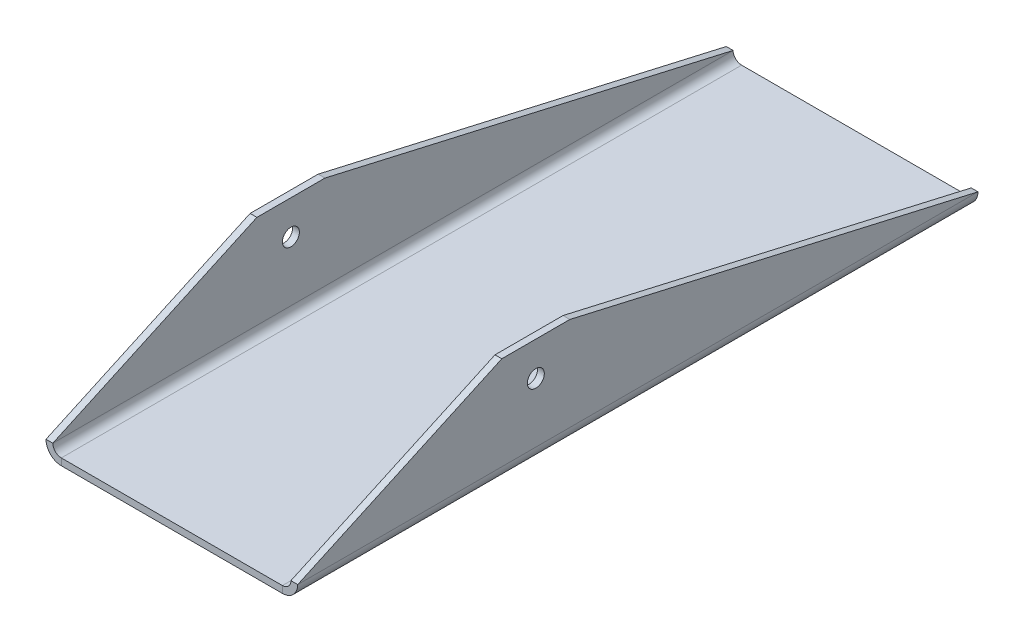
ISO-10303-21;
HEADER;
FILE_DESCRIPTION(('STEP AP214'),'2;1');
FILE_NAME('part.step','',(''),(''),'','','');
FILE_SCHEMA(('AUTOMOTIVE_DESIGN { 1 0 10303 214 1 1 1 1 }'));
ENDSEC;
DATA;
#1=APPLICATION_CONTEXT('core data for automotive mechanical design processes');
#2=APPLICATION_PROTOCOL_DEFINITION('international standard','automotive_design',2000,#1);
#3=PRODUCT_CONTEXT('',#1,'mechanical');
#4=PRODUCT('Part','Part','',(#3));
#5=PRODUCT_RELATED_PRODUCT_CATEGORY('part','',(#4));
#6=PRODUCT_DEFINITION_FORMATION('','',#4);
#7=PRODUCT_DEFINITION_CONTEXT('part definition',#1,'design');
#8=PRODUCT_DEFINITION('design','',#6,#7);
#9=PRODUCT_DEFINITION_SHAPE('','',#8);
#10=(LENGTH_UNIT() NAMED_UNIT(*) SI_UNIT(.MILLI.,.METRE.));
#11=(NAMED_UNIT(*) PLANE_ANGLE_UNIT() SI_UNIT($,.RADIAN.));
#12=(NAMED_UNIT(*) SI_UNIT($,.STERADIAN.) SOLID_ANGLE_UNIT());
#13=UNCERTAINTY_MEASURE_WITH_UNIT(LENGTH_MEASURE(1.E-05),#10,'distance_accuracy_value','');
#14=(GEOMETRIC_REPRESENTATION_CONTEXT(3) GLOBAL_UNCERTAINTY_ASSIGNED_CONTEXT((#13)) GLOBAL_UNIT_ASSIGNED_CONTEXT((#10,
#11,#12)) REPRESENTATION_CONTEXT('',''));
#15=CARTESIAN_POINT('',(0.,0.,0.));
#16=DIRECTION('',(0.,0.,1.));
#17=DIRECTION('',(1.,0.,0.));
#18=AXIS2_PLACEMENT_3D('',#15,#16,#17);
#19=CARTESIAN_POINT('',(88.9,38.1,254.));
#20=DIRECTION('',(0.,1.,0.));
#21=DIRECTION('',(0.,0.,1.));
#22=AXIS2_PLACEMENT_3D('',#19,#20,#21);
#23=PLANE('',#22);
#24=DIRECTION('',(0.,0.,-1.));
#25=VECTOR('',#24,1.);
#26=CARTESIAN_POINT('',(91.44,38.1,254.));
#27=LINE('',#26,#25);
#28=CARTESIAN_POINT('',(91.44,38.1,177.8));
#29=VERTEX_POINT('',#28);
#30=CARTESIAN_POINT('',(91.44,38.1,152.4));
#31=VERTEX_POINT('',#30);
#32=EDGE_CURVE('E201',#29,#31,#27,.T.);
#33=ORIENTED_EDGE('',*,*,#32,.T.);
#34=DIRECTION('',(-1.,0.,0.));
#35=VECTOR('',#34,1.);
#36=CARTESIAN_POINT('',(88.9,38.1,152.4));
#37=LINE('',#36,#35);
#38=CARTESIAN_POINT('',(88.9,38.1,152.4));
#39=VERTEX_POINT('',#38);
#40=EDGE_CURVE('E274',#39,#31,#37,.F.);
#41=ORIENTED_EDGE('',*,*,#40,.F.);
#42=DIRECTION('',(0.,0.,-1.));
#43=VECTOR('',#42,1.);
#44=CARTESIAN_POINT('',(88.9,38.1,254.));
#45=LINE('',#44,#43);
#46=CARTESIAN_POINT('',(88.9,38.1,177.8));
#47=VERTEX_POINT('',#46);
#48=EDGE_CURVE('E198',#47,#39,#45,.T.);
#49=ORIENTED_EDGE('',*,*,#48,.F.);
#50=DIRECTION('',(-1.,0.,0.));
#51=VECTOR('',#50,1.);
#52=CARTESIAN_POINT('',(88.9,38.1,177.8));
#53=LINE('',#52,#51);
#54=EDGE_CURVE('E54',#47,#29,#53,.F.);
#55=ORIENTED_EDGE('',*,*,#54,.T.);
#56=EDGE_LOOP('',(#33,#41,#49,#55));
#57=FACE_BOUND('',#56,.T.);
#58=ADVANCED_FACE('F39',(#57),#23,.T.);
#59=CARTESIAN_POINT('',(-2.54,38.1,254.));
#60=DIRECTION('',(0.,1.,0.));
#61=DIRECTION('',(0.,0.,1.));
#62=AXIS2_PLACEMENT_3D('',#59,#60,#61);
#63=PLANE('',#62);
#64=DIRECTION('',(0.,0.,-1.));
#65=VECTOR('',#64,1.);
#66=CARTESIAN_POINT('',(0.,38.1,254.));
#67=LINE('',#66,#65);
#68=CARTESIAN_POINT('',(0.,38.1,177.8));
#69=VERTEX_POINT('',#68);
#70=CARTESIAN_POINT('',(0.,38.1,152.4));
#71=VERTEX_POINT('',#70);
#72=EDGE_CURVE('E183',#69,#71,#67,.T.);
#73=ORIENTED_EDGE('',*,*,#72,.T.);
#74=DIRECTION('',(1.,0.,0.));
#75=VECTOR('',#74,1.);
#76=CARTESIAN_POINT('',(0.,38.1,152.4));
#77=LINE('',#76,#75);
#78=CARTESIAN_POINT('',(-2.54,38.1,152.4));
#79=VERTEX_POINT('',#78);
#80=EDGE_CURVE('E263',#71,#79,#77,.F.);
#81=ORIENTED_EDGE('',*,*,#80,.T.);
#82=DIRECTION('',(0.,0.,-1.));
#83=VECTOR('',#82,1.);
#84=CARTESIAN_POINT('',(-2.54,38.1,254.));
#85=LINE('',#84,#83);
#86=CARTESIAN_POINT('',(-2.54,38.1,177.8));
#87=VERTEX_POINT('',#86);
#88=EDGE_CURVE('E142',#87,#79,#85,.T.);
#89=ORIENTED_EDGE('',*,*,#88,.F.);
#90=DIRECTION('',(1.,0.,0.));
#91=VECTOR('',#90,1.);
#92=CARTESIAN_POINT('',(0.,38.1,177.8));
#93=LINE('',#92,#91);
#94=EDGE_CURVE('E116',#69,#87,#93,.F.);
#95=ORIENTED_EDGE('',*,*,#94,.F.);
#96=EDGE_LOOP('',(#73,#81,#89,#95));
#97=FACE_BOUND('',#96,.T.);
#98=ADVANCED_FACE('F284',(#97),#63,.T.);
#99=CARTESIAN_POINT('',(91.44,0.,254.));
#100=DIRECTION('',(-1.,0.,0.));
#101=DIRECTION('',(0.,0.,1.));
#102=AXIS2_PLACEMENT_3D('',#99,#100,#101);
#103=PLANE('',#102);
#104=DIRECTION('',(0.,0.223376156329396,0.974732318528274));
#105=VECTOR('',#104,1.);
#106=CARTESIAN_POINT('',(91.44,58.3204948453608,240.634886597938));
#107=LINE('',#106,#105);
#108=CARTESIAN_POINT('',(91.44,3.175,0.));
#109=VERTEX_POINT('',#108);
#110=EDGE_CURVE('E91',#109,#31,#107,.T.);
#111=ORIENTED_EDGE('',*,*,#110,.T.);
#112=ORIENTED_EDGE('',*,*,#32,.F.);
#113=DIRECTION('',(0.,-0.416654710493214,0.909064822894284));
#114=VECTOR('',#113,1.);
#115=CARTESIAN_POINT('',(91.44,2.62381635581062,255.202582496413));
#116=LINE('',#115,#114);
#117=CARTESIAN_POINT('',(91.44,3.175,254.));
#118=VERTEX_POINT('',#117);
#119=EDGE_CURVE('E253',#29,#118,#116,.T.);
#120=ORIENTED_EDGE('',*,*,#119,.T.);
#121=DIRECTION('',(0.,0.,-1.));
#122=VECTOR('',#121,1.);
#123=CARTESIAN_POINT('',(91.44,3.175,254.));
#124=LINE('',#123,#122);
#125=EDGE_CURVE('E157',#118,#109,#124,.T.);
#126=ORIENTED_EDGE('',*,*,#125,.T.);
#127=EDGE_LOOP('',(#111,#112,#120,#126));
#128=FACE_BOUND('',#127,.T.);
#129=CARTESIAN_POINT('',(91.44,25.4,165.1));
#130=DIRECTION('',(-1.,0.,0.));
#131=DIRECTION('',(0.,0.,1.));
#132=AXIS2_PLACEMENT_3D('',#129,#130,#131);
#133=CIRCLE('',#132,3.175);
#134=CARTESIAN_POINT('',(91.44,25.4,168.275));
#135=VERTEX_POINT('',#134);
#136=EDGE_CURVE('E256',#135,#135,#133,.T.);
#137=ORIENTED_EDGE('',*,*,#136,.T.);
#138=EDGE_LOOP('',(#137));
#139=FACE_BOUND('',#138,.T.);
#140=ADVANCED_FACE('F301',(#128,#139),#103,.F.);
#141=CARTESIAN_POINT('',(88.9,0.,254.));
#142=DIRECTION('',(-1.,0.,0.));
#143=DIRECTION('',(0.,0.,1.));
#144=AXIS2_PLACEMENT_3D('',#141,#142,#143);
#145=PLANE('',#144);
#146=CARTESIAN_POINT('',(88.9,25.4,165.1));
#147=DIRECTION('',(-1.,0.,0.));
#148=DIRECTION('',(0.,0.,1.));
#149=AXIS2_PLACEMENT_3D('',#146,#147,#148);
#150=CIRCLE('',#149,3.175);
#151=CARTESIAN_POINT('',(88.9,25.4,168.275));
#152=VERTEX_POINT('',#151);
#153=EDGE_CURVE('E266',#152,#152,#150,.T.);
#154=ORIENTED_EDGE('',*,*,#153,.F.);
#155=EDGE_LOOP('',(#154));
#156=FACE_BOUND('',#155,.T.);
#157=ORIENTED_EDGE('',*,*,#48,.T.);
#158=DIRECTION('',(0.,0.223376156329396,0.974732318528274));
#159=VECTOR('',#158,1.);
#160=CARTESIAN_POINT('',(88.9,58.3204948453608,240.634886597938));
#161=LINE('',#160,#159);
#162=CARTESIAN_POINT('',(88.9,3.175,0.));
#163=VERTEX_POINT('',#162);
#164=EDGE_CURVE('E276',#163,#39,#161,.T.);
#165=ORIENTED_EDGE('',*,*,#164,.F.);
#166=DIRECTION('',(0.,0.,-1.));
#167=VECTOR('',#166,1.);
#168=CARTESIAN_POINT('',(88.9,3.175,254.));
#169=LINE('',#168,#167);
#170=CARTESIAN_POINT('',(88.9,3.175,254.));
#171=VERTEX_POINT('',#170);
#172=EDGE_CURVE('E195',#171,#163,#169,.T.);
#173=ORIENTED_EDGE('',*,*,#172,.F.);
#174=DIRECTION('',(0.,-0.416654710493214,0.909064822894284));
#175=VECTOR('',#174,1.);
#176=CARTESIAN_POINT('',(88.9,2.62381635581062,255.202582496413));
#177=LINE('',#176,#175);
#178=EDGE_CURVE('E254',#47,#171,#177,.T.);
#179=ORIENTED_EDGE('',*,*,#178,.F.);
#180=EDGE_LOOP('',(#157,#165,#173,#179));
#181=FACE_BOUND('',#180,.T.);
#182=ADVANCED_FACE('F313',(#156,#181),#145,.T.);
#183=CARTESIAN_POINT('',(3.175,0.,254.));
#184=DIRECTION('',(0.,0.,1.));
#185=DIRECTION('',(1.,0.,0.));
#186=AXIS2_PLACEMENT_3D('',#183,#184,#185);
#187=PLANE('',#186);
#188=DIRECTION('',(0.,-1.,0.));
#189=VECTOR('',#188,1.);
#190=CARTESIAN_POINT('',(3.175,0.,254.));
#191=LINE('',#190,#189);
#192=CARTESIAN_POINT('',(3.175,0.,254.));
#193=VERTEX_POINT('',#192);
#194=CARTESIAN_POINT('',(3.175,-2.54,254.));
#195=VERTEX_POINT('',#194);
#196=EDGE_CURVE('E11',#193,#195,#191,.T.);
#197=ORIENTED_EDGE('',*,*,#196,.F.);
#198=CARTESIAN_POINT('',(3.175,3.17500000000001,254.));
#199=DIRECTION('',(0.,0.,-1.));
#200=DIRECTION('',(-1.,0.,0.));
#201=AXIS2_PLACEMENT_3D('',#198,#199,#200);
#202=CIRCLE('',#201,3.175);
#203=CARTESIAN_POINT('',(0.,3.17500000000003,254.));
#204=VERTEX_POINT('',#203);
#205=EDGE_CURVE('E130',#204,#193,#202,.F.);
#206=ORIENTED_EDGE('',*,*,#205,.F.);
#207=DIRECTION('',(1.,0.,0.));
#208=VECTOR('',#207,1.);
#209=CARTESIAN_POINT('',(-2.54,3.17500000000005,254.));
#210=LINE('',#209,#208);
#211=CARTESIAN_POINT('',(-2.54,3.17500000000005,254.));
#212=VERTEX_POINT('',#211);
#213=EDGE_CURVE('E47',#212,#204,#210,.T.);
#214=ORIENTED_EDGE('',*,*,#213,.F.);
#215=CARTESIAN_POINT('',(3.175,3.17500000000001,254.));
#216=DIRECTION('',(0.,0.,1.));
#217=DIRECTION('',(1.,0.,0.));
#218=AXIS2_PLACEMENT_3D('',#215,#216,#217);
#219=CIRCLE('',#218,5.715);
#220=EDGE_CURVE('E127',#212,#195,#219,.T.);
#221=ORIENTED_EDGE('',*,*,#220,.T.);
#222=EDGE_LOOP('',(#197,#206,#214,#221));
#223=FACE_BOUND('',#222,.T.);
#224=ADVANCED_FACE('F41',(#223),#187,.T.);
#225=CARTESIAN_POINT('',(-2.54,3.17500000000005,254.));
#226=DIRECTION('',(0.,0.,1.));
#227=DIRECTION('',(1.,0.,0.));
#228=AXIS2_PLACEMENT_3D('',#225,#226,#227);
#229=PLANE('',#228);
#230=DIRECTION('',(1.,0.,0.));
#231=VECTOR('',#230,1.);
#232=CARTESIAN_POINT('',(0.,0.,254.));
#233=LINE('',#232,#231);
#234=CARTESIAN_POINT('',(85.725,0.,254.));
#235=VERTEX_POINT('',#234);
#236=EDGE_CURVE('E152',#193,#235,#233,.T.);
#237=ORIENTED_EDGE('',*,*,#236,.F.);
#238=ORIENTED_EDGE('',*,*,#196,.T.);
#239=DIRECTION('',(1.,0.,0.));
#240=VECTOR('',#239,1.);
#241=CARTESIAN_POINT('',(0.,-2.54,254.));
#242=LINE('',#241,#240);
#243=CARTESIAN_POINT('',(85.725,-2.54,254.));
#244=VERTEX_POINT('',#243);
#245=EDGE_CURVE('E148',#195,#244,#242,.T.);
#246=ORIENTED_EDGE('',*,*,#245,.T.);
#247=DIRECTION('',(0.,1.,0.));
#248=VECTOR('',#247,1.);
#249=CARTESIAN_POINT('',(85.725,-2.54,254.));
#250=LINE('',#249,#248);
#251=EDGE_CURVE('E63',#244,#235,#250,.T.);
#252=ORIENTED_EDGE('',*,*,#251,.T.);
#253=EDGE_LOOP('',(#237,#238,#246,#252));
#254=FACE_BOUND('',#253,.T.);
#255=ADVANCED_FACE('F248',(#254),#229,.T.);
#256=CARTESIAN_POINT('',(0.,3.17500000000003,0.));
#257=DIRECTION('',(0.,0.,-1.));
#258=DIRECTION('',(-1.,0.,0.));
#259=AXIS2_PLACEMENT_3D('',#256,#257,#258);
#260=PLANE('',#259);
#261=DIRECTION('',(-1.,0.,0.));
#262=VECTOR('',#261,1.);
#263=CARTESIAN_POINT('',(0.,3.17500000000003,0.));
#264=LINE('',#263,#262);
#265=CARTESIAN_POINT('',(0.,3.175,0.));
#266=VERTEX_POINT('',#265);
#267=CARTESIAN_POINT('',(-2.54,3.17500000000005,0.));
#268=VERTEX_POINT('',#267);
#269=EDGE_CURVE('E131',#266,#268,#264,.T.);
#270=ORIENTED_EDGE('',*,*,#269,.F.);
#271=CARTESIAN_POINT('',(3.175,3.17500000000001,0.));
#272=DIRECTION('',(0.,0.,-1.));
#273=DIRECTION('',(-1.,0.,0.));
#274=AXIS2_PLACEMENT_3D('',#271,#272,#273);
#275=CIRCLE('',#274,3.175);
#276=CARTESIAN_POINT('',(3.175,0.,0.));
#277=VERTEX_POINT('',#276);
#278=EDGE_CURVE('E164',#266,#277,#275,.F.);
#279=ORIENTED_EDGE('',*,*,#278,.T.);
#280=DIRECTION('',(0.,1.,0.));
#281=VECTOR('',#280,1.);
#282=CARTESIAN_POINT('',(3.175,-2.54,0.));
#283=LINE('',#282,#281);
#284=CARTESIAN_POINT('',(3.175,-2.54,0.));
#285=VERTEX_POINT('',#284);
#286=EDGE_CURVE('E212',#285,#277,#283,.T.);
#287=ORIENTED_EDGE('',*,*,#286,.F.);
#288=CARTESIAN_POINT('',(3.175,3.17500000000001,0.));
#289=DIRECTION('',(0.,0.,1.));
#290=DIRECTION('',(1.,0.,0.));
#291=AXIS2_PLACEMENT_3D('',#288,#289,#290);
#292=CIRCLE('',#291,5.715);
#293=EDGE_CURVE('E167',#268,#285,#292,.T.);
#294=ORIENTED_EDGE('',*,*,#293,.F.);
#295=EDGE_LOOP('',(#270,#279,#287,#294));
#296=FACE_BOUND('',#295,.T.);
#297=ADVANCED_FACE('F225',(#296),#260,.T.);
#298=CARTESIAN_POINT('',(88.9,3.175,254.));
#299=DIRECTION('',(0.,0.,1.));
#300=DIRECTION('',(1.,0.,0.));
#301=AXIS2_PLACEMENT_3D('',#298,#299,#300);
#302=PLANE('',#301);
#303=DIRECTION('',(1.,0.,0.));
#304=VECTOR('',#303,1.);
#305=CARTESIAN_POINT('',(88.9,3.175,254.));
#306=LINE('',#305,#304);
#307=EDGE_CURVE('E209',#171,#118,#306,.T.);
#308=ORIENTED_EDGE('',*,*,#307,.F.);
#309=CARTESIAN_POINT('',(85.725,3.175,254.));
#310=DIRECTION('',(0.,0.,-1.));
#311=DIRECTION('',(-1.,0.,0.));
#312=AXIS2_PLACEMENT_3D('',#309,#310,#311);
#313=CIRCLE('',#312,3.175);
#314=EDGE_CURVE('E175',#235,#171,#313,.F.);
#315=ORIENTED_EDGE('',*,*,#314,.F.);
#316=ORIENTED_EDGE('',*,*,#251,.F.);
#317=CARTESIAN_POINT('',(85.725,3.175,254.));
#318=DIRECTION('',(0.,0.,1.));
#319=DIRECTION('',(1.,0.,0.));
#320=AXIS2_PLACEMENT_3D('',#317,#318,#319);
#321=CIRCLE('',#320,5.715);
#322=EDGE_CURVE('E150',#244,#118,#321,.T.);
#323=ORIENTED_EDGE('',*,*,#322,.T.);
#324=EDGE_LOOP('',(#308,#315,#316,#323));
#325=FACE_BOUND('',#324,.T.);
#326=ADVANCED_FACE('F319',(#325),#302,.T.);
#327=CARTESIAN_POINT('',(85.725,0.,0.));
#328=DIRECTION('',(0.,0.,-1.));
#329=DIRECTION('',(-1.,0.,0.));
#330=AXIS2_PLACEMENT_3D('',#327,#328,#329);
#331=PLANE('',#330);
#332=DIRECTION('',(0.,-1.,0.));
#333=VECTOR('',#332,1.);
#334=CARTESIAN_POINT('',(85.725,0.,0.));
#335=LINE('',#334,#333);
#336=CARTESIAN_POINT('',(85.725,0.,0.));
#337=VERTEX_POINT('',#336);
#338=CARTESIAN_POINT('',(85.725,-2.54,0.));
#339=VERTEX_POINT('',#338);
#340=EDGE_CURVE('E206',#337,#339,#335,.T.);
#341=ORIENTED_EDGE('',*,*,#340,.F.);
#342=CARTESIAN_POINT('',(85.725,3.175,0.));
#343=DIRECTION('',(0.,0.,-1.));
#344=DIRECTION('',(-1.,0.,0.));
#345=AXIS2_PLACEMENT_3D('',#342,#343,#344);
#346=CIRCLE('',#345,3.175);
#347=EDGE_CURVE('E158',#337,#163,#346,.F.);
#348=ORIENTED_EDGE('',*,*,#347,.T.);
#349=DIRECTION('',(-1.,0.,0.));
#350=VECTOR('',#349,1.);
#351=CARTESIAN_POINT('',(91.44,3.175,0.));
#352=LINE('',#351,#350);
#353=EDGE_CURVE('E204',#109,#163,#352,.T.);
#354=ORIENTED_EDGE('',*,*,#353,.F.);
#355=CARTESIAN_POINT('',(85.725,3.175,0.));
#356=DIRECTION('',(0.,0.,1.));
#357=DIRECTION('',(1.,0.,0.));
#358=AXIS2_PLACEMENT_3D('',#355,#356,#357);
#359=CIRCLE('',#358,5.715);
#360=EDGE_CURVE('E172',#339,#109,#359,.T.);
#361=ORIENTED_EDGE('',*,*,#360,.F.);
#362=EDGE_LOOP('',(#341,#348,#354,#361));
#363=FACE_BOUND('',#362,.T.);
#364=ADVANCED_FACE('F316',(#363),#331,.T.);
#365=CARTESIAN_POINT('',(91.44,3.175,0.));
#366=DIRECTION('',(0.,0.,-1.));
#367=DIRECTION('',(-1.,0.,0.));
#368=AXIS2_PLACEMENT_3D('',#365,#366,#367);
#369=PLANE('',#368);
#370=DIRECTION('',(1.,0.,0.));
#371=VECTOR('',#370,1.);
#372=CARTESIAN_POINT('',(0.,0.,0.));
#373=LINE('',#372,#371);
#374=EDGE_CURVE('E161',#277,#337,#373,.T.);
#375=ORIENTED_EDGE('',*,*,#374,.T.);
#376=ORIENTED_EDGE('',*,*,#340,.T.);
#377=DIRECTION('',(1.,0.,0.));
#378=VECTOR('',#377,1.);
#379=CARTESIAN_POINT('',(0.,-2.54,0.));
#380=LINE('',#379,#378);
#381=EDGE_CURVE('E169',#285,#339,#380,.T.);
#382=ORIENTED_EDGE('',*,*,#381,.F.);
#383=ORIENTED_EDGE('',*,*,#286,.T.);
#384=EDGE_LOOP('',(#375,#376,#382,#383));
#385=FACE_BOUND('',#384,.T.);
#386=ADVANCED_FACE('F242',(#385),#369,.T.);
#387=CARTESIAN_POINT('',(85.725,3.175,254.));
#388=DIRECTION('',(0.,0.,-1.));
#389=DIRECTION('',(-1.,0.,0.));
#390=AXIS2_PLACEMENT_3D('',#387,#388,#389);
#391=CYLINDRICAL_SURFACE('',#390,3.175);
#392=ORIENTED_EDGE('',*,*,#347,.F.);
#393=DIRECTION('',(0.,0.,-1.));
#394=VECTOR('',#393,1.);
#395=CARTESIAN_POINT('',(85.725,0.,254.));
#396=LINE('',#395,#394);
#397=EDGE_CURVE('E192',#235,#337,#396,.T.);
#398=ORIENTED_EDGE('',*,*,#397,.F.);
#399=ORIENTED_EDGE('',*,*,#314,.T.);
#400=ORIENTED_EDGE('',*,*,#172,.T.);
#401=EDGE_LOOP('',(#392,#398,#399,#400));
#402=FACE_BOUND('',#401,.T.);
#403=ADVANCED_FACE('F315',(#402),#391,.F.);
#404=CARTESIAN_POINT('',(0.,0.,254.));
#405=DIRECTION('',(0.,1.,0.));
#406=DIRECTION('',(0.,0.,1.));
#407=AXIS2_PLACEMENT_3D('',#404,#405,#406);
#408=PLANE('',#407);
#409=ORIENTED_EDGE('',*,*,#374,.F.);
#410=DIRECTION('',(0.,0.,-1.));
#411=VECTOR('',#410,1.);
#412=CARTESIAN_POINT('',(3.175,0.,254.));
#413=LINE('',#412,#411);
#414=EDGE_CURVE('E189',#193,#277,#413,.T.);
#415=ORIENTED_EDGE('',*,*,#414,.F.);
#416=ORIENTED_EDGE('',*,*,#236,.T.);
#417=ORIENTED_EDGE('',*,*,#397,.T.);
#418=EDGE_LOOP('',(#409,#415,#416,#417));
#419=FACE_BOUND('',#418,.T.);
#420=ADVANCED_FACE('F239',(#419),#408,.T.);
#421=CARTESIAN_POINT('',(3.175,3.17500000000001,254.));
#422=DIRECTION('',(0.,0.,-1.));
#423=DIRECTION('',(-1.,0.,0.));
#424=AXIS2_PLACEMENT_3D('',#421,#422,#423);
#425=CYLINDRICAL_SURFACE('',#424,3.175);
#426=ORIENTED_EDGE('',*,*,#278,.F.);
#427=DIRECTION('',(0.,0.,-1.));
#428=VECTOR('',#427,1.);
#429=CARTESIAN_POINT('',(0.,3.17500000000003,254.));
#430=LINE('',#429,#428);
#431=EDGE_CURVE('E186',#204,#266,#430,.T.);
#432=ORIENTED_EDGE('',*,*,#431,.F.);
#433=ORIENTED_EDGE('',*,*,#205,.T.);
#434=ORIENTED_EDGE('',*,*,#414,.T.);
#435=EDGE_LOOP('',(#426,#432,#433,#434));
#436=FACE_BOUND('',#435,.T.);
#437=ADVANCED_FACE('F234',(#436),#425,.F.);
#438=CARTESIAN_POINT('',(0.,38.1,254.));
#439=DIRECTION('',(1.,0.,0.));
#440=DIRECTION('',(0.,1.,0.));
#441=AXIS2_PLACEMENT_3D('',#438,#439,#440);
#442=PLANE('',#441);
#443=CARTESIAN_POINT('',(0.,25.4,165.1));
#444=DIRECTION('',(1.,0.,0.));
#445=DIRECTION('',(0.,1.,0.));
#446=AXIS2_PLACEMENT_3D('',#443,#444,#445);
#447=CIRCLE('',#446,3.175);
#448=CARTESIAN_POINT('',(0.,28.575,165.1));
#449=VERTEX_POINT('',#448);
#450=EDGE_CURVE('E259',#449,#449,#447,.T.);
#451=ORIENTED_EDGE('',*,*,#450,.F.);
#452=EDGE_LOOP('',(#451));
#453=FACE_BOUND('',#452,.T.);
#454=ORIENTED_EDGE('',*,*,#431,.T.);
#455=DIRECTION('',(0.,-0.223376156329396,-0.974732318528274));
#456=VECTOR('',#455,1.);
#457=CARTESIAN_POINT('',(0.,60.2215670103093,248.930474226804));
#458=LINE('',#457,#456);
#459=EDGE_CURVE('E223',#71,#266,#458,.T.);
#460=ORIENTED_EDGE('',*,*,#459,.F.);
#461=ORIENTED_EDGE('',*,*,#72,.F.);
#462=DIRECTION('',(0.,0.416654710493214,-0.909064822894284));
#463=VECTOR('',#462,1.);
#464=CARTESIAN_POINT('',(0.,9.23802008608322,240.771592539455));
#465=LINE('',#464,#463);
#466=EDGE_CURVE('E121',#204,#69,#465,.T.);
#467=ORIENTED_EDGE('',*,*,#466,.F.);
#468=EDGE_LOOP('',(#454,#460,#461,#467));
#469=FACE_BOUND('',#468,.T.);
#470=ADVANCED_FACE('F231',(#453,#469),#442,.T.);
#471=CARTESIAN_POINT('',(-2.54,38.1,254.));
#472=DIRECTION('',(1.,0.,0.));
#473=DIRECTION('',(0.,1.,0.));
#474=AXIS2_PLACEMENT_3D('',#471,#472,#473);
#475=PLANE('',#474);
#476=DIRECTION('',(0.,-0.223376156329396,-0.974732318528274));
#477=VECTOR('',#476,1.);
#478=CARTESIAN_POINT('',(-2.54,60.2215670103093,248.930474226804));
#479=LINE('',#478,#477);
#480=EDGE_CURVE('E138',#79,#268,#479,.T.);
#481=ORIENTED_EDGE('',*,*,#480,.T.);
#482=DIRECTION('',(0.,0.,-1.));
#483=VECTOR('',#482,1.);
#484=CARTESIAN_POINT('',(-2.54,3.17500000000005,254.));
#485=LINE('',#484,#483);
#486=EDGE_CURVE('E134',#212,#268,#485,.T.);
#487=ORIENTED_EDGE('',*,*,#486,.F.);
#488=DIRECTION('',(0.,0.416654710493214,-0.909064822894284));
#489=VECTOR('',#488,1.);
#490=CARTESIAN_POINT('',(-2.54,9.23802008608322,240.771592539455));
#491=LINE('',#490,#489);
#492=EDGE_CURVE('E108',#212,#87,#491,.T.);
#493=ORIENTED_EDGE('',*,*,#492,.T.);
#494=ORIENTED_EDGE('',*,*,#88,.T.);
#495=EDGE_LOOP('',(#481,#487,#493,#494));
#496=FACE_BOUND('',#495,.T.);
#497=CARTESIAN_POINT('',(-2.54,25.4,165.1));
#498=DIRECTION('',(1.,0.,0.));
#499=DIRECTION('',(0.,1.,0.));
#500=AXIS2_PLACEMENT_3D('',#497,#498,#499);
#501=CIRCLE('',#500,3.175);
#502=CARTESIAN_POINT('',(-2.54,28.575,165.1));
#503=VERTEX_POINT('',#502);
#504=EDGE_CURVE('E262',#503,#503,#501,.T.);
#505=ORIENTED_EDGE('',*,*,#504,.T.);
#506=EDGE_LOOP('',(#505));
#507=FACE_BOUND('',#506,.T.);
#508=ADVANCED_FACE('F135',(#496,#507),#475,.F.);
#509=CARTESIAN_POINT('',(3.175,3.17500000000001,254.));
#510=DIRECTION('',(0.,0.,-1.));
#511=DIRECTION('',(-1.,0.,0.));
#512=AXIS2_PLACEMENT_3D('',#509,#510,#511);
#513=CYLINDRICAL_SURFACE('',#512,5.715);
#514=ORIENTED_EDGE('',*,*,#293,.T.);
#515=DIRECTION('',(0.,0.,-1.));
#516=VECTOR('',#515,1.);
#517=CARTESIAN_POINT('',(3.175,-2.54,254.));
#518=LINE('',#517,#516);
#519=EDGE_CURVE('E143',#195,#285,#518,.T.);
#520=ORIENTED_EDGE('',*,*,#519,.F.);
#521=ORIENTED_EDGE('',*,*,#220,.F.);
#522=ORIENTED_EDGE('',*,*,#486,.T.);
#523=EDGE_LOOP('',(#514,#520,#521,#522));
#524=FACE_BOUND('',#523,.T.);
#525=ADVANCED_FACE('F145',(#524),#513,.T.);
#526=CARTESIAN_POINT('',(0.,-2.54,254.));
#527=DIRECTION('',(0.,1.,0.));
#528=DIRECTION('',(0.,0.,1.));
#529=AXIS2_PLACEMENT_3D('',#526,#527,#528);
#530=PLANE('',#529);
#531=ORIENTED_EDGE('',*,*,#381,.T.);
#532=DIRECTION('',(0.,0.,-1.));
#533=VECTOR('',#532,1.);
#534=CARTESIAN_POINT('',(85.725,-2.54,254.));
#535=LINE('',#534,#533);
#536=EDGE_CURVE('E178',#244,#339,#535,.T.);
#537=ORIENTED_EDGE('',*,*,#536,.F.);
#538=ORIENTED_EDGE('',*,*,#245,.F.);
#539=ORIENTED_EDGE('',*,*,#519,.T.);
#540=EDGE_LOOP('',(#531,#537,#538,#539));
#541=FACE_BOUND('',#540,.T.);
#542=ADVANCED_FACE('F245',(#541),#530,.F.);
#543=CARTESIAN_POINT('',(85.725,3.175,254.));
#544=DIRECTION('',(0.,0.,-1.));
#545=DIRECTION('',(-1.,0.,0.));
#546=AXIS2_PLACEMENT_3D('',#543,#544,#545);
#547=CYLINDRICAL_SURFACE('',#546,5.715);
#548=ORIENTED_EDGE('',*,*,#360,.T.);
#549=ORIENTED_EDGE('',*,*,#125,.F.);
#550=ORIENTED_EDGE('',*,*,#322,.F.);
#551=ORIENTED_EDGE('',*,*,#536,.T.);
#552=EDGE_LOOP('',(#548,#549,#550,#551));
#553=FACE_BOUND('',#552,.T.);
#554=ADVANCED_FACE('F318',(#553),#547,.T.);
#555=CARTESIAN_POINT('',(88.9,2.62381635581062,255.202582496413));
#556=DIRECTION('',(0.,-0.909064822894284,-0.416654710493214));
#557=DIRECTION('',(0.,-0.416654710493214,0.909064822894284));
#558=AXIS2_PLACEMENT_3D('',#555,#556,#557);
#559=PLANE('',#558);
#560=ORIENTED_EDGE('',*,*,#178,.T.);
#561=ORIENTED_EDGE('',*,*,#307,.T.);
#562=ORIENTED_EDGE('',*,*,#119,.F.);
#563=ORIENTED_EDGE('',*,*,#54,.F.);
#564=EDGE_LOOP('',(#560,#561,#562,#563));
#565=FACE_BOUND('',#564,.T.);
#566=ADVANCED_FACE('F293',(#565),#559,.F.);
#567=CARTESIAN_POINT('',(88.9,58.3204948453608,240.634886597938));
#568=DIRECTION('',(0.,-0.974732318528274,0.223376156329396));
#569=DIRECTION('',(0.,0.223376156329396,0.974732318528274));
#570=AXIS2_PLACEMENT_3D('',#567,#568,#569);
#571=PLANE('',#570);
#572=ORIENTED_EDGE('',*,*,#164,.T.);
#573=ORIENTED_EDGE('',*,*,#40,.T.);
#574=ORIENTED_EDGE('',*,*,#110,.F.);
#575=ORIENTED_EDGE('',*,*,#353,.T.);
#576=EDGE_LOOP('',(#572,#573,#574,#575));
#577=FACE_BOUND('',#576,.T.);
#578=ADVANCED_FACE('F308',(#577),#571,.F.);
#579=CARTESIAN_POINT('',(0.,9.23802008608322,240.771592539455));
#580=DIRECTION('',(0.,-0.909064822894284,-0.416654710493214));
#581=DIRECTION('',(0.,0.416654710493214,-0.909064822894284));
#582=AXIS2_PLACEMENT_3D('',#579,#580,#581);
#583=PLANE('',#582);
#584=ORIENTED_EDGE('',*,*,#466,.T.);
#585=ORIENTED_EDGE('',*,*,#94,.T.);
#586=ORIENTED_EDGE('',*,*,#492,.F.);
#587=ORIENTED_EDGE('',*,*,#213,.T.);
#588=EDGE_LOOP('',(#584,#585,#586,#587));
#589=FACE_BOUND('',#588,.T.);
#590=ADVANCED_FACE('F111',(#589),#583,.F.);
#591=CARTESIAN_POINT('',(0.,25.4,165.1));
#592=DIRECTION('',(1.,0.,0.));
#593=DIRECTION('',(0.,1.,0.));
#594=AXIS2_PLACEMENT_3D('',#591,#592,#593);
#595=CYLINDRICAL_SURFACE('',#594,3.175);
#596=ORIENTED_EDGE('',*,*,#504,.F.);
#597=EDGE_LOOP('',(#596));
#598=FACE_BOUND('',#597,.T.);
#599=ORIENTED_EDGE('',*,*,#450,.T.);
#600=EDGE_LOOP('',(#599));
#601=FACE_BOUND('',#600,.T.);
#602=ADVANCED_FACE('F363',(#598,#601),#595,.F.);
#603=CARTESIAN_POINT('',(0.,60.2215670103093,248.930474226804));
#604=DIRECTION('',(0.,-0.974732318528274,0.223376156329396));
#605=DIRECTION('',(0.,-0.223376156329396,-0.974732318528274));
#606=AXIS2_PLACEMENT_3D('',#603,#604,#605);
#607=PLANE('',#606);
#608=ORIENTED_EDGE('',*,*,#459,.T.);
#609=ORIENTED_EDGE('',*,*,#269,.T.);
#610=ORIENTED_EDGE('',*,*,#480,.F.);
#611=ORIENTED_EDGE('',*,*,#80,.F.);
#612=EDGE_LOOP('',(#608,#609,#610,#611));
#613=FACE_BOUND('',#612,.T.);
#614=ADVANCED_FACE('F217',(#613),#607,.F.);
#615=CARTESIAN_POINT('',(88.9,25.4,165.1));
#616=DIRECTION('',(-1.,0.,0.));
#617=DIRECTION('',(0.,0.,1.));
#618=AXIS2_PLACEMENT_3D('',#615,#616,#617);
#619=CYLINDRICAL_SURFACE('',#618,3.175);
#620=ORIENTED_EDGE('',*,*,#136,.F.);
#621=EDGE_LOOP('',(#620));
#622=FACE_BOUND('',#621,.T.);
#623=ORIENTED_EDGE('',*,*,#153,.T.);
#624=EDGE_LOOP('',(#623));
#625=FACE_BOUND('',#624,.T.);
#626=ADVANCED_FACE('F367',(#622,#625),#619,.F.);
#627=CLOSED_SHELL('',(#58,#98,#140,#182,#224,#255,#297,#326,#364,#386,#403,#420,#437,#470,#508,
#525,#542,#554,#566,#578,#590,#602,#614,#626));
#628=MANIFOLD_SOLID_BREP('B2',#627);
#629=ADVANCED_BREP_SHAPE_REPRESENTATION('',(#18,#628),#14);
#630=SHAPE_DEFINITION_REPRESENTATION(#9,#629);
ENDSEC;
END-ISO-10303-21;
